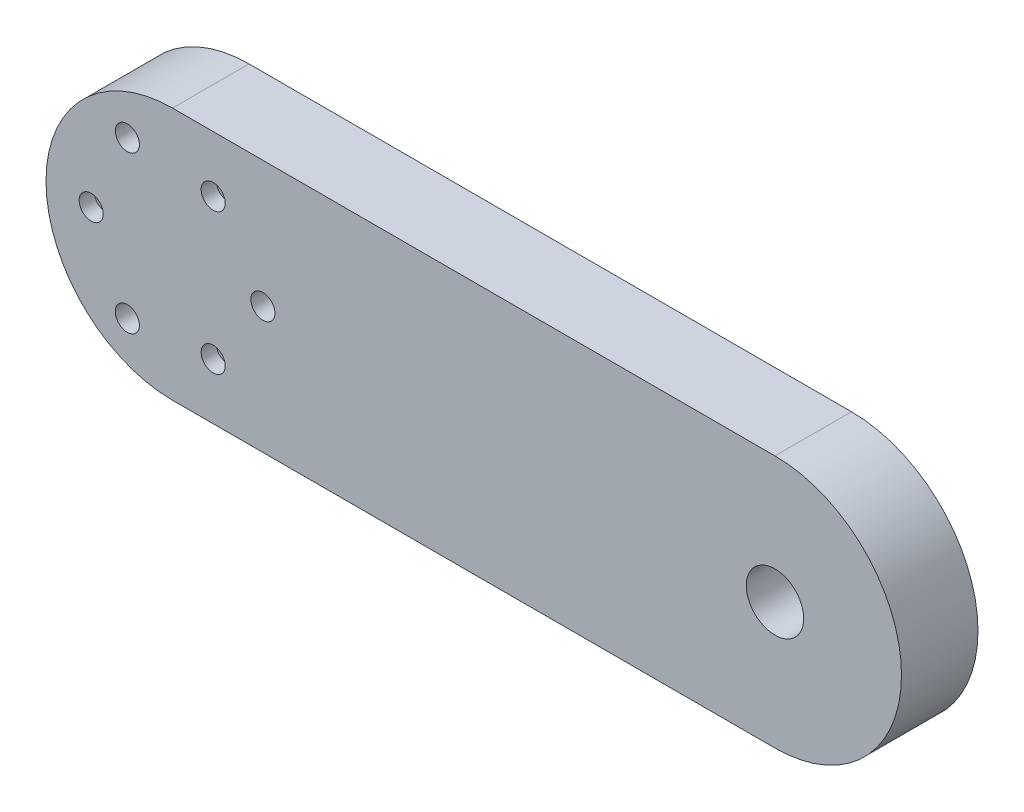
ISO-10303-21;
HEADER;
FILE_DESCRIPTION(('STEP AP214'),'2;1');
FILE_NAME('part.step','',(''),(''),'','','');
FILE_SCHEMA(('AUTOMOTIVE_DESIGN { 1 0 10303 214 1 1 1 1 }'));
ENDSEC;
DATA;
#1=APPLICATION_CONTEXT('core data for automotive mechanical design processes');
#2=APPLICATION_PROTOCOL_DEFINITION('international standard','automotive_design',2000,#1);
#3=PRODUCT_CONTEXT('',#1,'mechanical');
#4=PRODUCT('Part','Part','',(#3));
#5=PRODUCT_RELATED_PRODUCT_CATEGORY('part','',(#4));
#6=PRODUCT_DEFINITION_FORMATION('','',#4);
#7=PRODUCT_DEFINITION_CONTEXT('part definition',#1,'design');
#8=PRODUCT_DEFINITION('design','',#6,#7);
#9=PRODUCT_DEFINITION_SHAPE('','',#8);
#10=(LENGTH_UNIT() NAMED_UNIT(*) SI_UNIT(.MILLI.,.METRE.));
#11=(NAMED_UNIT(*) PLANE_ANGLE_UNIT() SI_UNIT($,.RADIAN.));
#12=(NAMED_UNIT(*) SI_UNIT($,.STERADIAN.) SOLID_ANGLE_UNIT());
#13=UNCERTAINTY_MEASURE_WITH_UNIT(LENGTH_MEASURE(1.E-05),#10,'distance_accuracy_value','');
#14=(GEOMETRIC_REPRESENTATION_CONTEXT(3) GLOBAL_UNCERTAINTY_ASSIGNED_CONTEXT((#13)) GLOBAL_UNIT_ASSIGNED_CONTEXT((#10,
#11,#12)) REPRESENTATION_CONTEXT('',''));
#15=CARTESIAN_POINT('',(0.,0.,0.));
#16=DIRECTION('',(0.,0.,1.));
#17=DIRECTION('',(1.,0.,0.));
#18=AXIS2_PLACEMENT_3D('',#15,#16,#17);
#19=CARTESIAN_POINT('',(0.,0.,12.7));
#20=DIRECTION('',(0.,0.,1.));
#21=DIRECTION('',(1.,0.,0.));
#22=AXIS2_PLACEMENT_3D('',#19,#20,#21);
#23=PLANE('',#22);
#24=CARTESIAN_POINT('',(-13.5,0.,12.7));
#25=DIRECTION('',(0.,0.,1.));
#26=DIRECTION('',(1.,0.,0.));
#27=AXIS2_PLACEMENT_3D('',#24,#25,#26);
#28=CIRCLE('',#27,2.);
#29=CARTESIAN_POINT('',(-11.5,0.,12.7));
#30=VERTEX_POINT('',#29);
#31=EDGE_CURVE('E182',#30,#30,#28,.T.);
#32=ORIENTED_EDGE('',*,*,#31,.F.);
#33=EDGE_LOOP('',(#32));
#34=FACE_BOUND('',#33,.T.);
#35=CARTESIAN_POINT('',(6.75000000000005,11.6913429510899,12.7));
#36=DIRECTION('',(0.,0.,1.));
#37=DIRECTION('',(1.,0.,0.));
#38=AXIS2_PLACEMENT_3D('',#35,#36,#37);
#39=CIRCLE('',#38,2.);
#40=CARTESIAN_POINT('',(8.75000000000006,11.6913429510899,12.7));
#41=VERTEX_POINT('',#40);
#42=EDGE_CURVE('E178',#41,#41,#39,.T.);
#43=ORIENTED_EDGE('',*,*,#42,.F.);
#44=EDGE_LOOP('',(#43));
#45=FACE_BOUND('',#44,.T.);
#46=CARTESIAN_POINT('',(6.74999999999989,-11.69134295109,12.7));
#47=DIRECTION('',(0.,0.,1.));
#48=DIRECTION('',(1.,0.,0.));
#49=AXIS2_PLACEMENT_3D('',#46,#47,#48);
#50=CIRCLE('',#49,2.);
#51=CARTESIAN_POINT('',(8.74999999999989,-11.69134295109,12.7));
#52=VERTEX_POINT('',#51);
#53=EDGE_CURVE('E170',#52,#52,#50,.T.);
#54=ORIENTED_EDGE('',*,*,#53,.F.);
#55=EDGE_LOOP('',(#54));
#56=FACE_BOUND('',#55,.T.);
#57=CARTESIAN_POINT('',(-7.50000000000006,-12.9903810567665,12.7));
#58=DIRECTION('',(0.,0.,1.));
#59=DIRECTION('',(1.,0.,0.));
#60=AXIS2_PLACEMENT_3D('',#57,#58,#59);
#61=CIRCLE('',#60,2.);
#62=CARTESIAN_POINT('',(-5.50000000000006,-12.9903810567665,12.7));
#63=VERTEX_POINT('',#62);
#64=EDGE_CURVE('E146',#63,#63,#61,.T.);
#65=ORIENTED_EDGE('',*,*,#64,.F.);
#66=EDGE_LOOP('',(#65));
#67=FACE_BOUND('',#66,.T.);
#68=CARTESIAN_POINT('',(100.,0.,12.7));
#69=DIRECTION('',(0.,0.,1.));
#70=DIRECTION('',(1.,0.,0.));
#71=AXIS2_PLACEMENT_3D('',#68,#69,#70);
#72=CIRCLE('',#71,4.7625);
#73=CARTESIAN_POINT('',(104.7625,0.,12.7));
#74=VERTEX_POINT('',#73);
#75=EDGE_CURVE('E116',#74,#74,#72,.T.);
#76=ORIENTED_EDGE('',*,*,#75,.F.);
#77=EDGE_LOOP('',(#76));
#78=FACE_BOUND('',#77,.T.);
#79=CARTESIAN_POINT('',(0.,0.,12.7));
#80=DIRECTION('',(0.,0.,1.));
#81=DIRECTION('',(1.,0.,0.));
#82=AXIS2_PLACEMENT_3D('',#79,#80,#81);
#83=CIRCLE('',#82,21.);
#84=CARTESIAN_POINT('',(0.,21.,12.7));
#85=VERTEX_POINT('',#84);
#86=CARTESIAN_POINT('',(0.,-21.,12.7));
#87=VERTEX_POINT('',#86);
#88=EDGE_CURVE('E96',#85,#87,#83,.T.);
#89=ORIENTED_EDGE('',*,*,#88,.T.);
#90=DIRECTION('',(1.,0.,0.));
#91=VECTOR('',#90,1.);
#92=CARTESIAN_POINT('',(0.,-21.,12.7));
#93=LINE('',#92,#91);
#94=CARTESIAN_POINT('',(100.,-21.,12.7));
#95=VERTEX_POINT('',#94);
#96=EDGE_CURVE('E91',#87,#95,#93,.T.);
#97=ORIENTED_EDGE('',*,*,#96,.T.);
#98=CARTESIAN_POINT('',(100.,0.,12.7));
#99=DIRECTION('',(0.,0.,1.));
#100=DIRECTION('',(1.,0.,0.));
#101=AXIS2_PLACEMENT_3D('',#98,#99,#100);
#102=CIRCLE('',#101,21.);
#103=CARTESIAN_POINT('',(100.,21.,12.7));
#104=VERTEX_POINT('',#103);
#105=EDGE_CURVE('E94',#95,#104,#102,.T.);
#106=ORIENTED_EDGE('',*,*,#105,.T.);
#107=DIRECTION('',(-1.,0.,0.));
#108=VECTOR('',#107,1.);
#109=CARTESIAN_POINT('',(0.,21.,12.7));
#110=LINE('',#109,#108);
#111=EDGE_CURVE('E61',#104,#85,#110,.T.);
#112=ORIENTED_EDGE('',*,*,#111,.T.);
#113=EDGE_LOOP('',(#89,#97,#106,#112));
#114=FACE_BOUND('',#113,.T.);
#115=CARTESIAN_POINT('',(15.,0.,12.7));
#116=DIRECTION('',(0.,0.,1.));
#117=DIRECTION('',(1.,0.,0.));
#118=AXIS2_PLACEMENT_3D('',#115,#116,#117);
#119=CIRCLE('',#118,2.);
#120=CARTESIAN_POINT('',(17.,0.,12.7));
#121=VERTEX_POINT('',#120);
#122=EDGE_CURVE('E138',#121,#121,#119,.T.);
#123=ORIENTED_EDGE('',*,*,#122,.F.);
#124=EDGE_LOOP('',(#123));
#125=FACE_BOUND('',#124,.T.);
#126=CARTESIAN_POINT('',(-7.49999999999988,12.9903810567667,12.7));
#127=DIRECTION('',(0.,0.,1.));
#128=DIRECTION('',(1.,0.,0.));
#129=AXIS2_PLACEMENT_3D('',#126,#127,#128);
#130=CIRCLE('',#129,2.);
#131=CARTESIAN_POINT('',(-5.49999999999988,12.9903810567667,12.7));
#132=VERTEX_POINT('',#131);
#133=EDGE_CURVE('E154',#132,#132,#130,.T.);
#134=ORIENTED_EDGE('',*,*,#133,.F.);
#135=EDGE_LOOP('',(#134));
#136=FACE_BOUND('',#135,.T.);
#137=ADVANCED_FACE('F43',(#34,#45,#56,#67,#78,#114,#125,#136),#23,.T.);
#138=CARTESIAN_POINT('',(0.,0.,0.));
#139=DIRECTION('',(0.,0.,1.));
#140=DIRECTION('',(1.,0.,0.));
#141=AXIS2_PLACEMENT_3D('',#138,#139,#140);
#142=PLANE('',#141);
#143=CARTESIAN_POINT('',(0.,0.,0.));
#144=DIRECTION('',(0.,0.,1.));
#145=DIRECTION('',(1.,0.,0.));
#146=AXIS2_PLACEMENT_3D('',#143,#144,#145);
#147=CIRCLE('',#146,21.);
#148=CARTESIAN_POINT('',(0.,21.,0.));
#149=VERTEX_POINT('',#148);
#150=CARTESIAN_POINT('',(0.,-21.,0.));
#151=VERTEX_POINT('',#150);
#152=EDGE_CURVE('E112',#149,#151,#147,.T.);
#153=ORIENTED_EDGE('',*,*,#152,.F.);
#154=DIRECTION('',(-1.,0.,0.));
#155=VECTOR('',#154,1.);
#156=CARTESIAN_POINT('',(0.,21.,0.));
#157=LINE('',#156,#155);
#158=CARTESIAN_POINT('',(100.,21.,0.));
#159=VERTEX_POINT('',#158);
#160=EDGE_CURVE('E84',#159,#149,#157,.T.);
#161=ORIENTED_EDGE('',*,*,#160,.F.);
#162=CARTESIAN_POINT('',(100.,0.,0.));
#163=DIRECTION('',(0.,0.,1.));
#164=DIRECTION('',(1.,0.,0.));
#165=AXIS2_PLACEMENT_3D('',#162,#163,#164);
#166=CIRCLE('',#165,21.);
#167=CARTESIAN_POINT('',(100.,-21.,0.));
#168=VERTEX_POINT('',#167);
#169=EDGE_CURVE('E78',#168,#159,#166,.T.);
#170=ORIENTED_EDGE('',*,*,#169,.F.);
#171=DIRECTION('',(1.,0.,0.));
#172=VECTOR('',#171,1.);
#173=CARTESIAN_POINT('',(0.,-21.,0.));
#174=LINE('',#173,#172);
#175=EDGE_CURVE('E101',#151,#168,#174,.T.);
#176=ORIENTED_EDGE('',*,*,#175,.F.);
#177=EDGE_LOOP('',(#153,#161,#170,#176));
#178=FACE_BOUND('',#177,.T.);
#179=CARTESIAN_POINT('',(100.,0.,0.));
#180=DIRECTION('',(0.,0.,1.));
#181=DIRECTION('',(1.,0.,0.));
#182=AXIS2_PLACEMENT_3D('',#179,#180,#181);
#183=CIRCLE('',#182,4.7625);
#184=CARTESIAN_POINT('',(104.7625,0.,0.));
#185=VERTEX_POINT('',#184);
#186=EDGE_CURVE('E134',#185,#185,#183,.T.);
#187=ORIENTED_EDGE('',*,*,#186,.T.);
#188=EDGE_LOOP('',(#187));
#189=FACE_BOUND('',#188,.T.);
#190=CARTESIAN_POINT('',(15.,0.,0.));
#191=DIRECTION('',(0.,0.,1.));
#192=DIRECTION('',(1.,0.,0.));
#193=AXIS2_PLACEMENT_3D('',#190,#191,#192);
#194=CIRCLE('',#193,2.);
#195=CARTESIAN_POINT('',(17.,0.,0.));
#196=VERTEX_POINT('',#195);
#197=EDGE_CURVE('E142',#196,#196,#194,.T.);
#198=ORIENTED_EDGE('',*,*,#197,.T.);
#199=EDGE_LOOP('',(#198));
#200=FACE_BOUND('',#199,.T.);
#201=CARTESIAN_POINT('',(-7.50000000000006,-12.9903810567665,0.));
#202=DIRECTION('',(0.,0.,1.));
#203=DIRECTION('',(1.,0.,0.));
#204=AXIS2_PLACEMENT_3D('',#201,#202,#203);
#205=CIRCLE('',#204,2.);
#206=CARTESIAN_POINT('',(-5.50000000000006,-12.9903810567665,0.));
#207=VERTEX_POINT('',#206);
#208=EDGE_CURVE('E150',#207,#207,#205,.T.);
#209=ORIENTED_EDGE('',*,*,#208,.T.);
#210=EDGE_LOOP('',(#209));
#211=FACE_BOUND('',#210,.T.);
#212=CARTESIAN_POINT('',(-7.49999999999988,12.9903810567667,0.));
#213=DIRECTION('',(0.,0.,1.));
#214=DIRECTION('',(1.,0.,0.));
#215=AXIS2_PLACEMENT_3D('',#212,#213,#214);
#216=CIRCLE('',#215,2.);
#217=CARTESIAN_POINT('',(-5.49999999999988,12.9903810567667,0.));
#218=VERTEX_POINT('',#217);
#219=EDGE_CURVE('E158',#218,#218,#216,.T.);
#220=ORIENTED_EDGE('',*,*,#219,.T.);
#221=EDGE_LOOP('',(#220));
#222=FACE_BOUND('',#221,.T.);
#223=ADVANCED_FACE('F129',(#178,#189,#200,#211,#222),#142,.F.);
#224=CARTESIAN_POINT('',(0.,0.,12.7));
#225=DIRECTION('',(0.,0.,-1.));
#226=DIRECTION('',(-1.,0.,0.));
#227=AXIS2_PLACEMENT_3D('',#224,#225,#226);
#228=CYLINDRICAL_SURFACE('',#227,21.);
#229=ORIENTED_EDGE('',*,*,#152,.T.);
#230=DIRECTION('',(0.,0.,-1.));
#231=VECTOR('',#230,1.);
#232=CARTESIAN_POINT('',(0.,-21.,12.7));
#233=LINE('',#232,#231);
#234=EDGE_CURVE('E11',#87,#151,#233,.T.);
#235=ORIENTED_EDGE('',*,*,#234,.F.);
#236=ORIENTED_EDGE('',*,*,#88,.F.);
#237=DIRECTION('',(0.,0.,-1.));
#238=VECTOR('',#237,1.);
#239=CARTESIAN_POINT('',(0.,21.,12.7));
#240=LINE('',#239,#238);
#241=EDGE_CURVE('E108',#85,#149,#240,.T.);
#242=ORIENTED_EDGE('',*,*,#241,.T.);
#243=EDGE_LOOP('',(#229,#235,#236,#242));
#244=FACE_BOUND('',#243,.T.);
#245=ADVANCED_FACE('F45',(#244),#228,.T.);
#246=CARTESIAN_POINT('',(0.,-21.,12.7));
#247=DIRECTION('',(0.,1.,0.));
#248=DIRECTION('',(0.,0.,1.));
#249=AXIS2_PLACEMENT_3D('',#246,#247,#248);
#250=PLANE('',#249);
#251=ORIENTED_EDGE('',*,*,#175,.T.);
#252=DIRECTION('',(0.,0.,-1.));
#253=VECTOR('',#252,1.);
#254=CARTESIAN_POINT('',(100.,-21.,12.7));
#255=LINE('',#254,#253);
#256=EDGE_CURVE('E53',#95,#168,#255,.T.);
#257=ORIENTED_EDGE('',*,*,#256,.F.);
#258=ORIENTED_EDGE('',*,*,#96,.F.);
#259=ORIENTED_EDGE('',*,*,#234,.T.);
#260=EDGE_LOOP('',(#251,#257,#258,#259));
#261=FACE_BOUND('',#260,.T.);
#262=ADVANCED_FACE('F100',(#261),#250,.F.);
#263=CARTESIAN_POINT('',(100.,0.,12.7));
#264=DIRECTION('',(0.,0.,-1.));
#265=DIRECTION('',(-1.,0.,0.));
#266=AXIS2_PLACEMENT_3D('',#263,#264,#265);
#267=CYLINDRICAL_SURFACE('',#266,21.);
#268=ORIENTED_EDGE('',*,*,#169,.T.);
#269=DIRECTION('',(0.,0.,-1.));
#270=VECTOR('',#269,1.);
#271=CARTESIAN_POINT('',(100.,21.,12.7));
#272=LINE('',#271,#270);
#273=EDGE_CURVE('E103',#104,#159,#272,.T.);
#274=ORIENTED_EDGE('',*,*,#273,.F.);
#275=ORIENTED_EDGE('',*,*,#105,.F.);
#276=ORIENTED_EDGE('',*,*,#256,.T.);
#277=EDGE_LOOP('',(#268,#274,#275,#276));
#278=FACE_BOUND('',#277,.T.);
#279=ADVANCED_FACE('F104',(#278),#267,.T.);
#280=CARTESIAN_POINT('',(0.,21.,12.7));
#281=DIRECTION('',(0.,-1.,0.));
#282=DIRECTION('',(0.,0.,-1.));
#283=AXIS2_PLACEMENT_3D('',#280,#281,#282);
#284=PLANE('',#283);
#285=ORIENTED_EDGE('',*,*,#160,.T.);
#286=ORIENTED_EDGE('',*,*,#241,.F.);
#287=ORIENTED_EDGE('',*,*,#111,.F.);
#288=ORIENTED_EDGE('',*,*,#273,.T.);
#289=EDGE_LOOP('',(#285,#286,#287,#288));
#290=FACE_BOUND('',#289,.T.);
#291=ADVANCED_FACE('F126',(#290),#284,.F.);
#292=CARTESIAN_POINT('',(100.,0.,12.7));
#293=DIRECTION('',(0.,0.,-1.));
#294=DIRECTION('',(-1.,0.,0.));
#295=AXIS2_PLACEMENT_3D('',#292,#293,#294);
#296=CYLINDRICAL_SURFACE('',#295,4.7625);
#297=ORIENTED_EDGE('',*,*,#75,.T.);
#298=EDGE_LOOP('',(#297));
#299=FACE_BOUND('',#298,.T.);
#300=ORIENTED_EDGE('',*,*,#186,.F.);
#301=EDGE_LOOP('',(#300));
#302=FACE_BOUND('',#301,.T.);
#303=ADVANCED_FACE('F210',(#299,#302),#296,.F.);
#304=CARTESIAN_POINT('',(15.,0.,12.7));
#305=DIRECTION('',(0.,0.,-1.));
#306=DIRECTION('',(-1.,0.,0.));
#307=AXIS2_PLACEMENT_3D('',#304,#305,#306);
#308=CYLINDRICAL_SURFACE('',#307,2.);
#309=ORIENTED_EDGE('',*,*,#122,.T.);
#310=EDGE_LOOP('',(#309));
#311=FACE_BOUND('',#310,.T.);
#312=ORIENTED_EDGE('',*,*,#197,.F.);
#313=EDGE_LOOP('',(#312));
#314=FACE_BOUND('',#313,.T.);
#315=ADVANCED_FACE('F213',(#311,#314),#308,.F.);
#316=CARTESIAN_POINT('',(-7.50000000000006,-12.9903810567665,12.7));
#317=DIRECTION('',(0.,0.,-1.));
#318=DIRECTION('',(-1.,0.,0.));
#319=AXIS2_PLACEMENT_3D('',#316,#317,#318);
#320=CYLINDRICAL_SURFACE('',#319,2.);
#321=ORIENTED_EDGE('',*,*,#64,.T.);
#322=EDGE_LOOP('',(#321));
#323=FACE_BOUND('',#322,.T.);
#324=ORIENTED_EDGE('',*,*,#208,.F.);
#325=EDGE_LOOP('',(#324));
#326=FACE_BOUND('',#325,.T.);
#327=ADVANCED_FACE('F228',(#323,#326),#320,.F.);
#328=CARTESIAN_POINT('',(-7.49999999999988,12.9903810567667,12.7));
#329=DIRECTION('',(0.,0.,-1.));
#330=DIRECTION('',(-1.,0.,0.));
#331=AXIS2_PLACEMENT_3D('',#328,#329,#330);
#332=CYLINDRICAL_SURFACE('',#331,2.);
#333=ORIENTED_EDGE('',*,*,#133,.T.);
#334=EDGE_LOOP('',(#333));
#335=FACE_BOUND('',#334,.T.);
#336=ORIENTED_EDGE('',*,*,#219,.F.);
#337=EDGE_LOOP('',(#336));
#338=FACE_BOUND('',#337,.T.);
#339=ADVANCED_FACE('F225',(#335,#338),#332,.F.);
#340=CARTESIAN_POINT('',(6.74999999999989,-11.69134295109,10.2));
#341=DIRECTION('',(0.,0.,1.));
#342=DIRECTION('',(1.,0.,0.));
#343=AXIS2_PLACEMENT_3D('',#340,#341,#342);
#344=CYLINDRICAL_SURFACE('',#343,2.);
#345=CARTESIAN_POINT('',(6.74999999999989,-11.69134295109,10.2));
#346=DIRECTION('',(0.,0.,1.));
#347=DIRECTION('',(1.,0.,0.));
#348=AXIS2_PLACEMENT_3D('',#345,#346,#347);
#349=CIRCLE('',#348,2.);
#350=CARTESIAN_POINT('',(8.74999999999989,-11.69134295109,10.2));
#351=VERTEX_POINT('',#350);
#352=EDGE_CURVE('E166',#351,#351,#349,.T.);
#353=ORIENTED_EDGE('',*,*,#352,.F.);
#354=EDGE_LOOP('',(#353));
#355=FACE_BOUND('',#354,.T.);
#356=ORIENTED_EDGE('',*,*,#53,.T.);
#357=EDGE_LOOP('',(#356));
#358=FACE_BOUND('',#357,.T.);
#359=ADVANCED_FACE('F227',(#355,#358),#344,.F.);
#360=CARTESIAN_POINT('',(6.74999999999989,-11.69134295109,10.2));
#361=DIRECTION('',(0.,0.,1.));
#362=DIRECTION('',(1.,0.,0.));
#363=AXIS2_PLACEMENT_3D('',#360,#361,#362);
#364=PLANE('',#363);
#365=ORIENTED_EDGE('',*,*,#352,.T.);
#366=EDGE_LOOP('',(#365));
#367=FACE_BOUND('',#366,.T.);
#368=ADVANCED_FACE('F235',(#367),#364,.T.);
#369=CARTESIAN_POINT('',(6.75000000000005,11.6913429510899,10.2));
#370=DIRECTION('',(0.,0.,1.));
#371=DIRECTION('',(1.,0.,0.));
#372=AXIS2_PLACEMENT_3D('',#369,#370,#371);
#373=CYLINDRICAL_SURFACE('',#372,2.);
#374=CARTESIAN_POINT('',(6.75000000000005,11.6913429510899,10.2));
#375=DIRECTION('',(0.,0.,1.));
#376=DIRECTION('',(1.,0.,0.));
#377=AXIS2_PLACEMENT_3D('',#374,#375,#376);
#378=CIRCLE('',#377,2.);
#379=CARTESIAN_POINT('',(8.75000000000006,11.6913429510899,10.2));
#380=VERTEX_POINT('',#379);
#381=EDGE_CURVE('E174',#380,#380,#378,.T.);
#382=ORIENTED_EDGE('',*,*,#381,.F.);
#383=EDGE_LOOP('',(#382));
#384=FACE_BOUND('',#383,.T.);
#385=ORIENTED_EDGE('',*,*,#42,.T.);
#386=EDGE_LOOP('',(#385));
#387=FACE_BOUND('',#386,.T.);
#388=ADVANCED_FACE('F282',(#384,#387),#373,.F.);
#389=CARTESIAN_POINT('',(6.75000000000005,11.6913429510899,10.2));
#390=DIRECTION('',(0.,0.,1.));
#391=DIRECTION('',(1.,0.,0.));
#392=AXIS2_PLACEMENT_3D('',#389,#390,#391);
#393=PLANE('',#392);
#394=ORIENTED_EDGE('',*,*,#381,.T.);
#395=EDGE_LOOP('',(#394));
#396=FACE_BOUND('',#395,.T.);
#397=ADVANCED_FACE('F195',(#396),#393,.T.);
#398=CARTESIAN_POINT('',(-13.5,0.,10.2));
#399=DIRECTION('',(0.,0.,1.));
#400=DIRECTION('',(1.,0.,0.));
#401=AXIS2_PLACEMENT_3D('',#398,#399,#400);
#402=CYLINDRICAL_SURFACE('',#401,2.);
#403=CARTESIAN_POINT('',(-13.5,0.,10.2));
#404=DIRECTION('',(0.,0.,1.));
#405=DIRECTION('',(1.,0.,0.));
#406=AXIS2_PLACEMENT_3D('',#403,#404,#405);
#407=CIRCLE('',#406,2.);
#408=CARTESIAN_POINT('',(-11.5,0.,10.2));
#409=VERTEX_POINT('',#408);
#410=EDGE_CURVE('E162',#409,#409,#407,.T.);
#411=ORIENTED_EDGE('',*,*,#410,.F.);
#412=EDGE_LOOP('',(#411));
#413=FACE_BOUND('',#412,.T.);
#414=ORIENTED_EDGE('',*,*,#31,.T.);
#415=EDGE_LOOP('',(#414));
#416=FACE_BOUND('',#415,.T.);
#417=ADVANCED_FACE('F192',(#413,#416),#402,.F.);
#418=CARTESIAN_POINT('',(-13.5,0.,10.2));
#419=DIRECTION('',(0.,0.,1.));
#420=DIRECTION('',(1.,0.,0.));
#421=AXIS2_PLACEMENT_3D('',#418,#419,#420);
#422=PLANE('',#421);
#423=ORIENTED_EDGE('',*,*,#410,.T.);
#424=EDGE_LOOP('',(#423));
#425=FACE_BOUND('',#424,.T.);
#426=ADVANCED_FACE('F190',(#425),#422,.T.);
#427=CLOSED_SHELL('',(#137,#223,#245,#262,#279,#291,#303,#315,#327,#339,#359,#368,#388,#397,
#417,#426));
#428=MANIFOLD_SOLID_BREP('B2',#427);
#429=ADVANCED_BREP_SHAPE_REPRESENTATION('',(#18,#428),#14);
#430=SHAPE_DEFINITION_REPRESENTATION(#9,#429);
ENDSEC;
END-ISO-10303-21;
